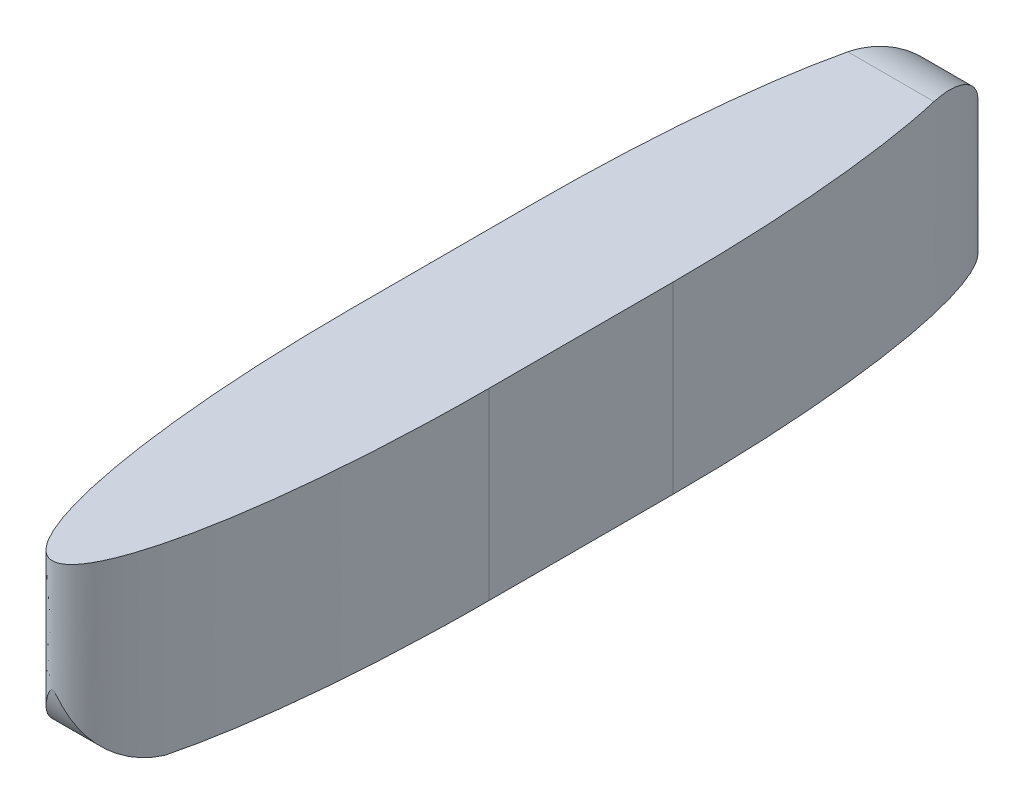
ISO-10303-21;
HEADER;
FILE_DESCRIPTION(('STEP AP214'),'2;1');
FILE_NAME('part.step','',(''),(''),'','','');
FILE_SCHEMA(('AUTOMOTIVE_DESIGN { 1 0 10303 214 1 1 1 1 }'));
ENDSEC;
DATA;
#1=APPLICATION_CONTEXT('core data for automotive mechanical design processes');
#2=APPLICATION_PROTOCOL_DEFINITION('international standard','automotive_design',2000,#1);
#3=PRODUCT_CONTEXT('',#1,'mechanical');
#4=PRODUCT('Part','Part','',(#3));
#5=PRODUCT_RELATED_PRODUCT_CATEGORY('part','',(#4));
#6=PRODUCT_DEFINITION_FORMATION('','',#4);
#7=PRODUCT_DEFINITION_CONTEXT('part definition',#1,'design');
#8=PRODUCT_DEFINITION('design','',#6,#7);
#9=PRODUCT_DEFINITION_SHAPE('','',#8);
#10=(LENGTH_UNIT() NAMED_UNIT(*) SI_UNIT(.MILLI.,.METRE.));
#11=(NAMED_UNIT(*) PLANE_ANGLE_UNIT() SI_UNIT($,.RADIAN.));
#12=(NAMED_UNIT(*) SI_UNIT($,.STERADIAN.) SOLID_ANGLE_UNIT());
#13=UNCERTAINTY_MEASURE_WITH_UNIT(LENGTH_MEASURE(1.E-05),#10,'distance_accuracy_value','');
#14=(GEOMETRIC_REPRESENTATION_CONTEXT(3) GLOBAL_UNCERTAINTY_ASSIGNED_CONTEXT((#13)) GLOBAL_UNIT_ASSIGNED_CONTEXT((#10,
#11,#12)) REPRESENTATION_CONTEXT('',''));
#15=CARTESIAN_POINT('',(0.,0.,0.));
#16=DIRECTION('',(0.,0.,1.));
#17=DIRECTION('',(1.,0.,0.));
#18=AXIS2_PLACEMENT_3D('',#15,#16,#17);
#19=CARTESIAN_POINT('',(0.,400.,0.));
#20=DIRECTION('',(1.,0.,0.));
#21=DIRECTION('',(0.,0.,-1.));
#22=AXIS2_PLACEMENT_3D('',#19,#20,#21);
#23=PLANE('',#22);
#24=DIRECTION('',(0.,0.,1.));
#25=VECTOR('',#24,1.);
#26=CARTESIAN_POINT('',(0.,0.,0.));
#27=LINE('',#26,#25);
#28=CARTESIAN_POINT('',(0.,0.,-400.));
#29=VERTEX_POINT('',#28);
#30=CARTESIAN_POINT('',(0.,0.,0.));
#31=VERTEX_POINT('',#30);
#32=EDGE_CURVE('E74',#29,#31,#27,.T.);
#33=ORIENTED_EDGE('',*,*,#32,.T.);
#34=DIRECTION('',(0.,-1.,0.));
#35=VECTOR('',#34,1.);
#36=CARTESIAN_POINT('',(0.,400.,0.));
#37=LINE('',#36,#35);
#38=CARTESIAN_POINT('',(0.,400.,0.));
#39=VERTEX_POINT('',#38);
#40=EDGE_CURVE('E112',#39,#31,#37,.T.);
#41=ORIENTED_EDGE('',*,*,#40,.F.);
#42=DIRECTION('',(0.,0.,1.));
#43=VECTOR('',#42,1.);
#44=CARTESIAN_POINT('',(0.,400.,0.));
#45=LINE('',#44,#43);
#46=CARTESIAN_POINT('',(0.,400.,-400.));
#47=VERTEX_POINT('',#46);
#48=EDGE_CURVE('E102',#47,#39,#45,.T.);
#49=ORIENTED_EDGE('',*,*,#48,.F.);
#50=DIRECTION('',(0.,-1.,0.));
#51=VECTOR('',#50,1.);
#52=CARTESIAN_POINT('',(0.,400.,-400.));
#53=LINE('',#52,#51);
#54=EDGE_CURVE('E101',#47,#29,#53,.T.);
#55=ORIENTED_EDGE('',*,*,#54,.T.);
#56=EDGE_LOOP('',(#33,#41,#49,#55));
#57=FACE_BOUND('',#56,.T.);
#58=ADVANCED_FACE('F39',(#57),#23,.F.);
#59=CARTESIAN_POINT('',(300.,400.,0.));
#60=DIRECTION('',(-1.,0.,0.));
#61=DIRECTION('',(0.,0.,1.));
#62=AXIS2_PLACEMENT_3D('',#59,#60,#61);
#63=PLANE('',#62);
#64=DIRECTION('',(0.,0.,-1.));
#65=VECTOR('',#64,1.);
#66=CARTESIAN_POINT('',(300.,0.,0.));
#67=LINE('',#66,#65);
#68=CARTESIAN_POINT('',(300.,0.,0.));
#69=VERTEX_POINT('',#68);
#70=CARTESIAN_POINT('',(300.,0.,-400.));
#71=VERTEX_POINT('',#70);
#72=EDGE_CURVE('E204',#69,#71,#67,.T.);
#73=ORIENTED_EDGE('',*,*,#72,.T.);
#74=DIRECTION('',(0.,-1.,0.));
#75=VECTOR('',#74,1.);
#76=CARTESIAN_POINT('',(300.,400.,-400.));
#77=LINE('',#76,#75);
#78=CARTESIAN_POINT('',(300.,400.,-400.));
#79=VERTEX_POINT('',#78);
#80=EDGE_CURVE('E97',#79,#71,#77,.T.);
#81=ORIENTED_EDGE('',*,*,#80,.F.);
#82=DIRECTION('',(0.,0.,-1.));
#83=VECTOR('',#82,1.);
#84=CARTESIAN_POINT('',(300.,400.,0.));
#85=LINE('',#84,#83);
#86=CARTESIAN_POINT('',(300.,400.,0.));
#87=VERTEX_POINT('',#86);
#88=EDGE_CURVE('E92',#87,#79,#85,.T.);
#89=ORIENTED_EDGE('',*,*,#88,.F.);
#90=DIRECTION('',(0.,-1.,0.));
#91=VECTOR('',#90,1.);
#92=CARTESIAN_POINT('',(300.,400.,0.));
#93=LINE('',#92,#91);
#94=EDGE_CURVE('E95',#87,#69,#93,.T.);
#95=ORIENTED_EDGE('',*,*,#94,.T.);
#96=EDGE_LOOP('',(#73,#81,#89,#95));
#97=FACE_BOUND('',#96,.T.);
#98=ADVANCED_FACE('F94',(#97),#63,.F.);
#99=CARTESIAN_POINT('',(0.,400.,0.));
#100=DIRECTION('',(0.,-1.,0.));
#101=DIRECTION('',(0.,0.,-1.));
#102=AXIS2_PLACEMENT_3D('',#99,#100,#101);
#103=PLANE('',#102);
#104=CARTESIAN_POINT('',(150.,400.,-400.));
#105=DIRECTION('',(0.,1.,0.));
#106=DIRECTION('',(0.,0.,1.));
#107=AXIS2_PLACEMENT_3D('',#104,#105,#106);
#108=ELLIPSE('',#107,800.,150.);
#109=CARTESIAN_POINT('',(243.770889506856,400.,-1024.41058357816));
#110=VERTEX_POINT('',#109);
#111=EDGE_CURVE('E128',#79,#110,#108,.T.);
#112=ORIENTED_EDGE('',*,*,#111,.T.);
#113=DIRECTION('',(-1.,0.,0.));
#114=VECTOR('',#113,1.);
#115=CARTESIAN_POINT('',(400.,400.,-1024.41058357816));
#116=LINE('',#115,#114);
#117=CARTESIAN_POINT('',(56.2291104931438,400.,-1024.41058357816));
#118=VERTEX_POINT('',#117);
#119=EDGE_CURVE('E120',#110,#118,#116,.T.);
#120=ORIENTED_EDGE('',*,*,#119,.T.);
#121=EDGE_CURVE('E61',#118,#47,#108,.T.);
#122=ORIENTED_EDGE('',*,*,#121,.T.);
#123=ORIENTED_EDGE('',*,*,#48,.T.);
#124=CARTESIAN_POINT('',(150.,400.,-1.11022302462516E-13));
#125=DIRECTION('',(0.,1.,0.));
#126=DIRECTION('',(0.,0.,1.));
#127=AXIS2_PLACEMENT_3D('',#124,#125,#126);
#128=ELLIPSE('',#127,800.,150.);
#129=EDGE_CURVE('E108',#39,#87,#128,.T.);
#130=ORIENTED_EDGE('',*,*,#129,.T.);
#131=ORIENTED_EDGE('',*,*,#88,.T.);
#132=EDGE_LOOP('',(#112,#120,#122,#123,#130,#131));
#133=FACE_BOUND('',#132,.T.);
#134=ADVANCED_FACE('F114',(#133),#103,.F.);
#135=CARTESIAN_POINT('',(0.,0.,0.));
#136=DIRECTION('',(0.,-1.,0.));
#137=DIRECTION('',(0.,0.,-1.));
#138=AXIS2_PLACEMENT_3D('',#135,#136,#137);
#139=PLANE('',#138);
#140=DIRECTION('',(-1.,0.,0.));
#141=VECTOR('',#140,1.);
#142=CARTESIAN_POINT('',(400.,0.,643.353757445879));
#143=LINE('',#142,#141);
#144=CARTESIAN_POINT('',(239.155400780709,0.,643.353757445879));
#145=VERTEX_POINT('',#144);
#146=CARTESIAN_POINT('',(60.8445992192913,0.,643.353757445879));
#147=VERTEX_POINT('',#146);
#148=EDGE_CURVE('E115',#145,#147,#143,.T.);
#149=ORIENTED_EDGE('',*,*,#148,.T.);
#150=CARTESIAN_POINT('',(150.,0.,-1.11022302462516E-13));
#151=DIRECTION('',(0.,1.,0.));
#152=DIRECTION('',(0.,0.,1.));
#153=AXIS2_PLACEMENT_3D('',#150,#151,#152);
#154=ELLIPSE('',#153,800.,150.);
#155=EDGE_CURVE('E117',#31,#147,#154,.T.);
#156=ORIENTED_EDGE('',*,*,#155,.F.);
#157=ORIENTED_EDGE('',*,*,#32,.F.);
#158=CARTESIAN_POINT('',(150.,0.,-400.));
#159=DIRECTION('',(0.,1.,0.));
#160=DIRECTION('',(0.,0.,1.));
#161=AXIS2_PLACEMENT_3D('',#158,#159,#160);
#162=ELLIPSE('',#161,800.,150.);
#163=EDGE_CURVE('E124',#71,#29,#162,.T.);
#164=ORIENTED_EDGE('',*,*,#163,.F.);
#165=ORIENTED_EDGE('',*,*,#72,.F.);
#166=EDGE_CURVE('E110',#145,#69,#154,.T.);
#167=ORIENTED_EDGE('',*,*,#166,.F.);
#168=EDGE_LOOP('',(#149,#156,#157,#164,#165,#167));
#169=FACE_BOUND('',#168,.T.);
#170=ADVANCED_FACE('F135',(#169),#139,.T.);
#171=DIRECTION('',(0.,1.,0.));
#172=VECTOR('',#171,1.);
#173=SURFACE_OF_LINEAR_EXTRUSION('',#162,#172);
#174=CARTESIAN_POINT('',(243.770889506857,400.,-1024.41058357816));
#175=CARTESIAN_POINT('',(243.163301228322,399.955558802038,-1027.00601896267));
#176=CARTESIAN_POINT('',(242.546728650748,399.854515992237,-1029.59835873491));
#177=CARTESIAN_POINT('',(241.295948376345,399.540181654458,-1034.77143362733));
#178=CARTESIAN_POINT('',(240.661744061431,399.326911513841,-1037.35217086414));
#179=CARTESIAN_POINT('',(239.37586482704,398.789085601332,-1042.49736902288));
#180=CARTESIAN_POINT('',(238.724191617104,398.464540682626,-1045.06183150733));
#181=CARTESIAN_POINT('',(237.403579271261,397.705368678969,-1050.16985649317));
#182=CARTESIAN_POINT('',(236.734640569988,397.27074436269,-1052.71341951856));
#183=CARTESIAN_POINT('',(235.381020827399,396.293715391588,-1057.77024737073));
#184=CARTESIAN_POINT('',(234.696371589303,395.751513960743,-1060.28355998999));
#185=CARTESIAN_POINT('',(233.31040683478,394.560395339782,-1065.28017481669));
#186=CARTESIAN_POINT('',(232.609090977733,393.911475967046,-1067.76347640923));
#187=CARTESIAN_POINT('',(231.190113232056,392.508692531502,-1072.69557013919));
#188=CARTESIAN_POINT('',(230.472451068561,391.754826702923,-1075.14436169519));
#189=CARTESIAN_POINT('',(229.021138847086,390.144121673066,-1080.00300473195));
#190=CARTESIAN_POINT('',(228.287488902964,389.287283204927,-1082.4128564898));
#191=CARTESIAN_POINT('',(226.804747847893,387.472989160374,-1087.18878525028));
#192=CARTESIAN_POINT('',(226.055660698571,386.515559146393,-1089.55487319534));
#193=CARTESIAN_POINT('',(224.542252367749,384.502199958145,-1094.23977906014));
#194=CARTESIAN_POINT('',(223.777931244497,383.446271160436,-1096.55859716055));
#195=CARTESIAN_POINT('',(222.234455083313,381.238357533732,-1101.14499794535));
#196=CARTESIAN_POINT('',(221.455300019025,380.086372534065,-1103.41258053869));
#197=CARTESIAN_POINT('',(219.882590634366,377.688958144709,-1107.8926376668));
#198=CARTESIAN_POINT('',(219.089036501895,376.443529973747,-1110.10511291981));
#199=CARTESIAN_POINT('',(217.487903251414,373.861856228638,-1114.47144479331));
#200=CARTESIAN_POINT('',(216.680323146856,372.52560424678,-1116.62529726288));
#201=CARTESIAN_POINT('',(215.051653965621,369.765228519628,-1120.87066094383));
#202=CARTESIAN_POINT('',(214.23056495374,368.341105195724,-1122.96217245411));
#203=CARTESIAN_POINT('',(212.575337282498,365.40794370607,-1127.07948857427));
#204=CARTESIAN_POINT('',(211.741198478563,363.898904599094,-1129.10529245544));
#205=CARTESIAN_POINT('',(210.060362553556,360.79900884726,-1133.08793124485));
#206=CARTESIAN_POINT('',(209.213665335224,359.208151568515,-1135.04476561856));
#207=CARTESIAN_POINT('',(207.484810548002,355.903073398828,-1138.93907987682));
#208=CARTESIAN_POINT('',(206.602317505449,354.186665138648,-1140.8745548699));
#209=CARTESIAN_POINT('',(204.825080552977,350.674263332979,-1144.66639973427));
#210=CARTESIAN_POINT('',(203.930335492516,348.878262277316,-1146.52276210813));
#211=CARTESIAN_POINT('',(202.129314920947,345.210637221389,-1150.1530263522));
#212=CARTESIAN_POINT('',(201.223040347003,343.339019340982,-1151.92693487073));
#213=CARTESIAN_POINT('',(199.399368718077,339.523570692962,-1155.38979374384));
#214=CARTESIAN_POINT('',(198.481970450021,337.579732000858,-1157.07873472713));
#215=CARTESIAN_POINT('',(196.63610797665,333.622522826414,-1160.36989505152));
#216=CARTESIAN_POINT('',(195.707636657447,331.609105870976,-1161.97205452072));
#217=CARTESIAN_POINT('',(193.840940883407,327.518134730804,-1165.08573302975));
#218=CARTESIAN_POINT('',(192.902717470513,325.440587352166,-1166.59726163837));
#219=CARTESIAN_POINT('',(191.016959672968,321.224990034922,-1169.52762021213));
#220=CARTESIAN_POINT('',(190.069424728931,319.086936446755,-1170.94644456846));
#221=CARTESIAN_POINT('',(188.165789454975,314.754678615365,-1173.68901486912));
#222=CARTESIAN_POINT('',(187.209689597173,312.560477454895,-1175.01276601827));
#223=CARTESIAN_POINT('',(184.929393953401,307.287176710106,-1178.04153866294));
#224=CARTESIAN_POINT('',(183.601585942738,304.184739166246,-1179.70343274105));
#225=CARTESIAN_POINT('',(180.932340615647,297.89184370421,-1182.83920008838));
#226=CARTESIAN_POINT('',(179.590902461223,294.701380353165,-1184.31306172069));
#227=CARTESIAN_POINT('',(176.89578366386,288.242964673721,-1187.06881768774));
#228=CARTESIAN_POINT('',(175.542101251262,284.975001029841,-1188.35068378766));
#229=CARTESIAN_POINT('',(172.826732524689,278.379347880222,-1190.71643591746));
#230=CARTESIAN_POINT('',(171.465065566811,275.051779587617,-1191.80068257352));
#231=CARTESIAN_POINT('',(168.732710966283,268.342555990636,-1193.77105178039));
#232=CARTESIAN_POINT('',(167.362024780282,264.960909299844,-1194.65720555309));
#233=CARTESIAN_POINT('',(165.300283929627,259.857581819469,-1195.83589837484));
#234=CARTESIAN_POINT('',(164.612238867626,258.151712966726,-1196.20364121326));
#235=CARTESIAN_POINT('',(163.234060217831,254.730775237228,-1196.88885831842));
#236=CARTESIAN_POINT('',(162.543926736023,253.015706824047,-1197.20633509397));
#237=CARTESIAN_POINT('',(161.351542987392,250.050789047868,-1197.71041583411));
#238=CARTESIAN_POINT('',(160.849830218192,248.802741503017,-1197.90899743673));
#239=CARTESIAN_POINT('',(159.845051242289,246.303413620965,-1198.2795462031));
#240=CARTESIAN_POINT('',(159.341985204667,245.052133688333,-1198.45151654765));
#241=CARTESIAN_POINT('',(158.334306910021,242.547595761693,-1198.76872382996));
#242=CARTESIAN_POINT('',(157.829695630818,241.294339194608,-1198.91397510491));
#243=CARTESIAN_POINT('',(157.070713473909,239.413200017718,-1199.11184723197));
#244=CARTESIAN_POINT('',(156.81737287787,238.785938801505,-1199.17447096028));
#245=CARTESIAN_POINT('',(156.309771315159,237.531159163486,-1199.29304477842));
#246=CARTESIAN_POINT('',(156.055510353844,236.903640743196,-1199.34899490704));
#247=CARTESIAN_POINT('',(155.578287943386,235.728756905954,-1199.44749289395));
#248=CARTESIAN_POINT('',(155.35547891247,235.181396360224,-1199.49083974609));
#249=CARTESIAN_POINT('',(154.908497273986,234.0868565934,-1199.57244866053));
#250=CARTESIAN_POINT('',(154.684324674898,233.539677371199,-1199.61071075443));
#251=CARTESIAN_POINT('',(154.233932760192,232.445724451059,-1199.68215239861));
#252=CARTESIAN_POINT('',(154.00771312382,231.898950831724,-1199.71533113724));
#253=CARTESIAN_POINT('',(153.665937503353,231.079602606876,-1199.76127760672));
#254=CARTESIAN_POINT('',(153.551605340207,230.806623640076,-1199.77595607525));
#255=CARTESIAN_POINT('',(153.321853139807,230.26105859004,-1199.80403829628));
#256=CARTESIAN_POINT('',(153.206433106695,229.988472505313,-1199.81744205362));
#257=CARTESIAN_POINT('',(152.989281471489,229.479419945641,-1199.8413069013));
#258=CARTESIAN_POINT('',(152.887730050089,229.242883965152,-1199.85192371025));
#259=CARTESIAN_POINT('',(152.683118806822,228.77041646293,-1199.87219155364));
#260=CARTESIAN_POINT('',(152.580058952905,228.534484954165,-1199.88184256752));
#261=CARTESIAN_POINT('',(152.371859059734,228.063577939092,-1199.90017376564));
#262=CARTESIAN_POINT('',(152.266719590656,227.828602191468,-1199.90885421175));
#263=CARTESIAN_POINT('',(152.053363470422,227.36002373619,-1199.92524280789));
#264=CARTESIAN_POINT('',(151.945146974707,227.126420959895,-1199.93295100691));
#265=CARTESIAN_POINT('',(151.756854711434,226.730842788499,-1199.94523347046));
#266=CARTESIAN_POINT('',(151.678015363587,226.568290166887,-1199.95005663423));
#267=CARTESIAN_POINT('',(151.557084787498,226.325742808459,-1199.956925201));
#268=CARTESIAN_POINT('',(151.516321321171,226.245092052071,-1199.95915408291));
#269=CARTESIAN_POINT('',(151.433688512885,226.084356601835,-1199.96348797571));
#270=CARTESIAN_POINT('',(151.391819195361,226.004271895528,-1199.96559298935));
#271=CARTESIAN_POINT('',(151.291584090017,225.816547562515,-1199.97040197772));
#272=CARTESIAN_POINT('',(151.232637216558,225.709215470102,-1199.9730533954));
#273=CARTESIAN_POINT('',(151.111188107339,225.496693429717,-1199.97811459557));
#274=CARTESIAN_POINT('',(151.048689728526,225.391501320212,-1199.98052463262));
#275=CARTESIAN_POINT('',(150.939460057334,225.218323610929,-1199.98434363521));
#276=CARTESIAN_POINT('',(150.89423507877,225.149393495362,-1199.98582272264));
#277=CARTESIAN_POINT('',(150.800140345653,225.013708661653,-1199.9886578919));
#278=CARTESIAN_POINT('',(150.751260323343,224.946960891494,-1199.99001360154));
#279=CARTESIAN_POINT('',(150.673822396334,224.849565869225,-1199.99194008285));
#280=CARTESIAN_POINT('',(150.647180258229,224.817402010683,-1199.99256724807));
#281=CARTESIAN_POINT('',(150.592264770791,224.754505476402,-1199.99377736941));
#282=CARTESIAN_POINT('',(150.563992091893,224.723772221697,-1199.99436034346));
#283=CARTESIAN_POINT('',(150.505517327442,224.664402563005,-1199.99547206521));
#284=CARTESIAN_POINT('',(150.475322858141,224.63575874249,-1199.99600100768));
#285=CARTESIAN_POINT('',(150.412448871204,224.581376049671,-1199.99699330016));
#286=CARTESIAN_POINT('',(150.379773477403,224.555632526041,-1199.99745675551));
#287=CARTESIAN_POINT('',(150.317736394768,224.51285590834,-1199.99821897932));
#288=CARTESIAN_POINT('',(150.288886176671,224.495093042818,-1199.99853234809));
#289=CARTESIAN_POINT('',(150.22902337513,224.463647668718,-1199.99908338085));
#290=CARTESIAN_POINT('',(150.198014002103,224.449959255268,-1199.99932115443));
#291=CARTESIAN_POINT('',(150.138958801787,224.429808613281,-1199.99966972464));
#292=CARTESIAN_POINT('',(150.111187470398,224.422560272908,-1199.99979439944));
#293=CARTESIAN_POINT('',(150.054817865067,224.412883242615,-1199.99996064263));
#294=CARTESIAN_POINT('',(150.026220549388,224.41044917862,-1200.00000230368));
#295=CARTESIAN_POINT('',(149.969002341575,224.410729812589,-1199.99999749349));
#296=CARTESIAN_POINT('',(149.940381493569,224.41345337891,-1199.99995087045));
#297=CARTESIAN_POINT('',(149.884010616597,224.423687321926,-1199.99977501287));
#298=CARTESIAN_POINT('',(149.856261627347,224.431203202001,-1199.99964568334));
#299=CARTESIAN_POINT('',(149.7910702193,224.454072778959,-1199.99924986519));
#300=CARTESIAN_POINT('',(149.754324532576,224.471377383533,-1199.99894886635));
#301=CARTESIAN_POINT('',(149.683890200216,224.511347347785,-1199.99824577441));
#302=CARTESIAN_POINT('',(149.65021086541,224.53402832737,-1199.99784338652));
#303=CARTESIAN_POINT('',(149.575922347886,224.590200540361,-1199.99683415291));
#304=CARTESIAN_POINT('',(149.536242838957,224.624898261046,-1199.99620212295));
#305=CARTESIAN_POINT('',(149.460336557592,224.697925817632,-1199.99484804833));
#306=CARTESIAN_POINT('',(149.424117285819,224.736263200103,-1199.99412581563));
#307=CARTESIAN_POINT('',(149.354117107733,224.815511880436,-1199.9926055856));
#308=CARTESIAN_POINT('',(149.32035320137,224.856438017013,-1199.991807135));
#309=CARTESIAN_POINT('',(149.254928697002,224.939848686423,-1199.99014990404));
#310=CARTESIAN_POINT('',(149.223265907041,224.982331521059,-1199.98929118852));
#311=CARTESIAN_POINT('',(149.14720383823,225.088446370726,-1199.98710721304));
#312=CARTESIAN_POINT('',(149.103722851432,225.152732976031,-1199.98575057583));
#313=CARTESIAN_POINT('',(149.019234457174,225.282917491428,-1199.98293099106));
#314=CARTESIAN_POINT('',(148.97822783337,225.348815902805,-1199.98146801012));
#315=CARTESIAN_POINT('',(148.89800772501,225.481862156237,-1199.97843926179));
#316=CARTESIAN_POINT('',(148.858797865162,225.549012169936,-1199.9768733009));
#317=CARTESIAN_POINT('',(148.781832446595,225.684140369494,-1199.97364481997));
#318=CARTESIAN_POINT('',(148.744076992123,225.752118614258,-1199.97198229302));
#319=CARTESIAN_POINT('',(148.632452914944,225.957112646226,-1199.96685040413));
#320=CARTESIAN_POINT('',(148.560302370288,226.095058980897,-1199.9632396556));
#321=CARTESIAN_POINT('',(148.419081203828,226.372385026756,-1199.95565496826));
#322=CARTESIAN_POINT('',(148.350008711844,226.511763802464,-1199.95168125457));
#323=CARTESIAN_POINT('',(148.21411098977,226.791363104767,-1199.9433795404));
#324=CARTESIAN_POINT('',(148.147282805277,226.931582213412,-1199.93905203368));
#325=CARTESIAN_POINT('',(148.01524920301,227.212679276094,-1199.93004340617));
#326=CARTESIAN_POINT('',(147.95004295955,227.353556849659,-1199.92536247042));
#327=CARTESIAN_POINT('',(147.757272166714,227.774680829226,-1199.91086851491));
#328=CARTESIAN_POINT('',(147.631459515632,228.055710490209,-1199.9005363927));
#329=CARTESIAN_POINT('',(147.382753509483,228.619007170997,-1199.87848771092));
#330=CARTESIAN_POINT('',(147.259860253253,228.901274232312,-1199.86677110455));
#331=CARTESIAN_POINT('',(147.015974268985,229.466801871911,-1199.84194842241));
#332=CARTESIAN_POINT('',(146.894982935866,229.750063008594,-1199.82884137689));
#333=CARTESIAN_POINT('',(146.654413030564,230.317118031272,-1199.80124659651));
#334=CARTESIAN_POINT('',(146.534834466933,230.600911920479,-1199.78675885331));
#335=CARTESIAN_POINT('',(146.17758848174,231.452948795219,-1199.74122017861));
#336=CARTESIAN_POINT('',(145.941461613535,232.021728071277,-1199.70809901547));
#337=CARTESIAN_POINT('',(145.472006615504,233.159007497301,-1199.63640202108));
#338=CARTESIAN_POINT('',(145.238674560838,233.727506598596,-1199.59783514225));
#339=CARTESIAN_POINT('',(144.773655292037,234.864615152606,-1199.51522075707));
#340=CARTESIAN_POINT('',(144.541967685727,235.433224543347,-1199.47117460727));
#341=CARTESIAN_POINT('',(144.079710357383,236.570415931204,-1199.37760047013));
#342=CARTESIAN_POINT('',(143.849140588472,237.13899792846,-1199.32807271476));
#343=CARTESIAN_POINT('',(143.155756542211,238.851580237291,-1199.17061662345));
#344=CARTESIAN_POINT('',(142.694160272626,239.995317168274,-1199.05433059009));
#345=CARTESIAN_POINT('',(141.772935663913,242.281139464509,-1198.79959807672));
#346=CARTESIAN_POINT('',(141.313307376752,243.423224785627,-1198.66115101517));
#347=CARTESIAN_POINT('',(140.39532299724,245.705464548337,-1198.36208697377));
#348=CARTESIAN_POINT('',(139.936967388591,246.845618204783,-1198.20146249971));
#349=CARTESIAN_POINT('',(139.021411993372,249.123034112026,-1197.85813161368));
#350=CARTESIAN_POINT('',(138.564212198692,250.260296383113,-1197.67542535709));
#351=CARTESIAN_POINT('',(137.194057563,253.667160897525,-1197.09423433706));
#352=CARTESIAN_POINT('',(136.282561929795,255.931804832912,-1196.66268204081));
#353=CARTESIAN_POINT('',(134.461477460458,260.44830128081,-1195.71104312948));
#354=CARTESIAN_POINT('',(133.551895521146,262.700121380374,-1195.19079012573));
#355=CARTESIAN_POINT('',(131.736498173466,267.183223755189,-1194.06293841946));
#356=CARTESIAN_POINT('',(130.830682590734,269.414506987134,-1193.45534380783));
#357=CARTESIAN_POINT('',(129.0229600605,273.85356706227,-1192.15344631621));
#358=CARTESIAN_POINT('',(128.121053711589,276.061340376067,-1191.45913061107));
#359=CARTESIAN_POINT('',(125.835772583975,281.634754772743,-1189.58653125137));
#360=CARTESIAN_POINT('',(124.455339944416,284.98200914266,-1188.34933454791));
#361=CARTESIAN_POINT('',(121.706047443707,291.601472342344,-1185.67450301097));
#362=CARTESIAN_POINT('',(120.337191142301,294.873658582969,-1184.2368087426));
#363=CARTESIAN_POINT('',(117.612917447098,301.330803464185,-1181.16522019572));
#364=CARTESIAN_POINT('',(116.257501153837,304.515754998584,-1179.53130999137));
#365=CARTESIAN_POINT('',(113.561277462733,310.788134194104,-1176.07134630113));
#366=CARTESIAN_POINT('',(112.220477146665,313.87551584604,-1174.24520387518));
#367=CARTESIAN_POINT('',(109.555908117991,319.93970094942,-1170.40696556552));
#368=CARTESIAN_POINT('',(108.232138182797,322.916512367833,-1168.39488311602));
#369=CARTESIAN_POINT('',(105.603179673593,328.748767531055,-1164.19065095095));
#370=CARTESIAN_POINT('',(104.297990638396,331.60421429169,-1161.99850571381));
#371=CARTESIAN_POINT('',(102.034907914704,336.478492360445,-1158.0163942398));
#372=CARTESIAN_POINT('',(101.072517380202,338.52655285334,-1156.2645984262));
#373=CARTESIAN_POINT('',(99.1596341362072,342.544576285961,-1152.66704573246));
#374=CARTESIAN_POINT('',(98.2091421939677,344.514534206985,-1150.82128283156));
#375=CARTESIAN_POINT('',(96.3208058849388,348.371842170567,-1147.03917075725));
#376=CARTESIAN_POINT('',(95.3829616293831,350.259191486928,-1145.10282078782));
#377=CARTESIAN_POINT('',(93.5205944758043,353.947023982001,-1141.14302845059));
#378=CARTESIAN_POINT('',(92.596071289568,355.747509042083,-1139.11958797084));
#379=CARTESIAN_POINT('',(90.7608888383317,359.257698497223,-1134.98905870525));
#380=CARTESIAN_POINT('',(89.8502307396238,360.967395285191,-1132.88196293576));
#381=CARTESIAN_POINT('',(88.0434830883982,364.291866475311,-1128.58815112314));
#382=CARTESIAN_POINT('',(87.1473935071508,365.906641064671,-1126.40143523707));
#383=CARTESIAN_POINT('',(85.3703925019661,369.037421300807,-1121.95245758563));
#384=CARTESIAN_POINT('',(84.4894808596696,370.553428369388,-1119.69019690847));
#385=CARTESIAN_POINT('',(82.7434964303385,373.482870094365,-1115.09460794956));
#386=CARTESIAN_POINT('',(81.8784224772611,374.896312324942,-1112.76128493369));
#387=CARTESIAN_POINT('',(79.9092761835372,378.02259071616,-1107.32264122374));
#388=CARTESIAN_POINT('',(78.8107639181788,379.699206330982,-1104.19438320823));
#389=CARTESIAN_POINT('',(76.6424185201172,382.866662164612,-1097.83556132831));
#390=CARTESIAN_POINT('',(75.5725859454809,384.357498770476,-1094.60499547579));
#391=CARTESIAN_POINT('',(73.4625613761291,387.146881308053,-1088.05190715309));
#392=CARTESIAN_POINT('',(72.422372983709,388.445403949981,-1084.7293736031));
#393=CARTESIAN_POINT('',(70.3742125801782,390.8421587067,-1078.008644019));
#394=CARTESIAN_POINT('',(69.3661983799941,391.940662815546,-1074.61055789287));
#395=CARTESIAN_POINT('',(67.3819884357206,393.933974278235,-1067.74659138518));
#396=CARTESIAN_POINT('',(66.4057887478026,394.828806962765,-1064.28071949244));
#397=CARTESIAN_POINT('',(64.4863230241762,396.409825267073,-1057.29433692711));
#398=CARTESIAN_POINT('',(63.5430407704151,397.096114955969,-1053.77385443179));
#399=CARTESIAN_POINT('',(62.2450329955701,397.908888206648,-1048.81210697437));
#400=CARTESIAN_POINT('',(61.8762347020989,398.124443506126,-1047.38863059891));
#401=CARTESIAN_POINT('',(61.1440972941316,398.521208634597,-1044.53579361856));
#402=CARTESIAN_POINT('',(60.7807569864908,398.70242607367,-1043.10643438937));
#403=CARTESIAN_POINT('',(60.0595511514722,399.030336865624,-1040.24257122256));
#404=CARTESIAN_POINT('',(59.7016850091495,399.177034123386,-1038.80806788548));
#405=CARTESIAN_POINT('',(58.9919890390233,399.435543168708,-1035.93688000774));
#406=CARTESIAN_POINT('',(58.6401504765157,399.547410346381,-1034.50020261929));
#407=CARTESIAN_POINT('',(57.9419240721707,399.73642205334,-1031.62307308507));
#408=CARTESIAN_POINT('',(57.595536843868,399.813562700829,-1030.18262053539));
#409=CARTESIAN_POINT('',(56.9082087863219,399.932979466349,-1027.29862480247));
#410=CARTESIAN_POINT('',(56.5672692216684,399.975247601341,-1025.85508098736));
#411=CARTESIAN_POINT('',(56.2291104931438,400.,-1024.41058357816));
#412=B_SPLINE_CURVE_WITH_KNOTS('',3,(#174,#175,#176,#177,#178,#179,#180,#181,#182,#183,#184,
#185,#186,#187,#188,#189,#190,#191,#192,#193,#194,#195,#196,#197,#198,#199,#200,#201,#202,#203,
#204,#205,#206,#207,#208,#209,#210,#211,#212,#213,#214,#215,#216,#217,#218,#219,#220,#221,#222,
#223,#224,#225,#226,#227,#228,#229,#230,#231,#232,#233,#234,#235,#236,#237,#238,#239,#240,#241,
#242,#243,#244,#245,#246,#247,#248,#249,#250,#251,#252,#253,#254,#255,#256,#257,#258,#259,#260,
#261,#262,#263,#264,#265,#266,#267,#268,#269,#270,#271,#272,#273,#274,#275,#276,#277,#278,#279,
#280,#281,#282,#283,#284,#285,#286,#287,#288,#289,#290,#291,#292,#293,#294,#295,#296,#297,#298,
#299,#300,#301,#302,#303,#304,#305,#306,#307,#308,#309,#310,#311,#312,#313,#314,#315,#316,#317,
#318,#319,#320,#321,#322,#323,#324,#325,#326,#327,#328,#329,#330,#331,#332,#333,#334,#335,#336,
#337,#338,#339,#340,#341,#342,#343,#344,#345,#346,#347,#348,#349,#350,#351,#352,#353,#354,#355,
#356,#357,#358,#359,#360,#361,#362,#363,#364,#365,#366,#367,#368,#369,#370,#371,#372,#373,#374,
#375,#376,#377,#378,#379,#380,#381,#382,#383,#384,#385,#386,#387,#388,#389,#390,#391,#392,#393,
#394,#395,#396,#397,#398,#399,#400,#401,#402,#403,#404,#405,#406,#407,#408,#409,#410,#411),
.UNSPECIFIED.,.F.,.F.,(4,2,2,2,2,2,2,2,2,2,2,2,2,2,2,2,2,2,2,2,2,2,2,2,2,2,2,2,2,2,2,2,2,2,2,2,
2,2,2,2,2,2,2,2,2,2,2,2,2,2,2,2,2,2,2,2,2,2,2,2,2,2,2,2,2,2,2,2,2,2,2,2,2,2,2,2,2,2,2,2,2,2,2,2,
2,2,2,2,2,2,2,2,2,2,2,2,2,2,2,2,2,2,2,2,2,2,2,2,2,2,2,2,2,2,2,2,2,2,4),(0.,7.99727664027056,
15.993029776973,23.9880032696335,31.9827756959796,39.9625865781377,47.9425606855765,
55.9226690760045,63.9027206536005,71.8807492145029,79.8587472769027,87.8367595149586,
95.8146677184911,103.793139356843,111.771572737174,119.750094569795,127.728678225366,
135.926219320215,144.124535568177,152.322189630175,160.520745859006,168.72488817616,
176.928162769466,185.131933219817,193.335254208966,204.614167079833,215.893777638677,
227.175045349012,238.435515671497,249.694209950367,255.321052204388,260.947613531016,
265.026458576872,269.10481570599,273.180978003225,275.219096607907,277.257203366837,
279.034858699057,280.812502986133,282.590430812454,283.479383371079,284.368332546334,
285.141225795215,285.91413548968,286.686836131431,287.45949780806,288.001645183121,
288.272822146187,288.543993121865,288.911400692171,289.27841661134,289.525722103178,
289.773750503664,289.899019097319,290.024236546053,290.148985400514,290.273531253136,
290.374948496796,290.476218038461,290.561962037125,290.647610267441,290.733405900499,
290.819300237148,290.940453515071,291.06196318775,291.219718853126,291.377809070527,
291.5369062079,291.695834672098,291.928612268128,292.161463204298,292.394764879358,
292.628083245583,293.095168002208,293.561964983671,294.028121251625,294.494035142991,
295.418239689048,296.342475479724,297.267360166328,298.192250448249,300.042419297231,
301.88958124514,303.736286781539,305.582914193486,309.299216705987,313.015616754212,
316.733275740851,320.450908568488,327.886291424059,335.335778522177,342.784916817262,
350.235158070211,361.707609813542,373.183469673121,384.660261599509,396.142387026757,
407.623683515605,419.104694535209,427.687440038512,436.270736159528,444.854107719522,
453.437293290954,462.021196910698,470.605083600497,479.188846693924,487.771975249377,
498.911620819645,510.051482994825,521.192693138741,532.31863794284,543.443198252271,
554.562197925831,559.020463140323,563.477739139504,567.934510694325,572.384158030897,
576.834302634034,581.285465684731),.UNSPECIFIED.);
#413=EDGE_CURVE('E11',#110,#118,#412,.T.);
#414=ORIENTED_EDGE('',*,*,#413,.F.);
#415=ORIENTED_EDGE('',*,*,#111,.F.);
#416=ORIENTED_EDGE('',*,*,#80,.T.);
#417=ORIENTED_EDGE('',*,*,#163,.T.);
#418=ORIENTED_EDGE('',*,*,#54,.F.);
#419=ORIENTED_EDGE('',*,*,#121,.F.);
#420=EDGE_LOOP('',(#414,#415,#416,#417,#418,#419));
#421=FACE_BOUND('',#420,.T.);
#422=ADVANCED_FACE('F130',(#421),#173,.T.);
#423=DIRECTION('',(0.,1.,0.));
#424=VECTOR('',#423,1.);
#425=SURFACE_OF_LINEAR_EXTRUSION('',#154,#424);
#426=CARTESIAN_POINT('',(239.155400780709,0.,643.353757445879));
#427=CARTESIAN_POINT('',(238.530766093788,0.299273296008533,645.815974513094));
#428=CARTESIAN_POINT('',(237.898058510155,0.649357812685615,648.269947469416));
#429=CARTESIAN_POINT('',(236.616846689006,1.44982406170865,653.156801784059));
#430=CARTESIAN_POINT('',(235.968345569609,1.90018613693933,655.589687179137));
#431=CARTESIAN_POINT('',(234.655723076272,2.89994556275868,660.43046476344));
#432=CARTESIAN_POINT('',(233.991603426311,3.44933202719594,662.838359669229));
#433=CARTESIAN_POINT('',(232.647950469406,4.64569074969144,667.625315722199));
#434=CARTESIAN_POINT('',(231.968417803169,5.29265895764361,670.004378061643));
#435=CARTESIAN_POINT('',(230.594170433263,6.68259876507967,674.729864824013));
#436=CARTESIAN_POINT('',(229.899455618593,7.42557106667015,677.076289008107));
#437=CARTESIAN_POINT('',(228.498349772924,9.00213076687778,681.721980172364));
#438=CARTESIAN_POINT('',(227.792026888158,9.8352870421777,684.021414050242));
#439=CARTESIAN_POINT('',(226.36491551373,11.5930929142372,688.580458306743));
#440=CARTESIAN_POINT('',(225.644127095869,12.5177420569449,690.840068882934));
#441=CARTESIAN_POINT('',(224.18840925156,14.456490890656,695.31584784162));
#442=CARTESIAN_POINT('',(223.453480262607,15.4705878177012,697.532017563864));
#443=CARTESIAN_POINT('',(221.969830311638,17.5860354431286,701.917380110394));
#444=CARTESIAN_POINT('',(221.221110369299,18.6873797103311,704.086576382207));
#445=CARTESIAN_POINT('',(219.710259663145,20.9749578785296,708.374527461483));
#446=CARTESIAN_POINT('',(218.948130742068,22.1611801827649,710.493289107237));
#447=CARTESIAN_POINT('',(217.364806677329,24.689548971601,714.802358591037));
#448=CARTESIAN_POINT('',(216.542800986543,26.0367760623103,716.989389630942));
#449=CARTESIAN_POINT('',(214.884498289175,28.8209004290965,721.299618620237));
#450=CARTESIAN_POINT('',(214.048202959554,30.2577872349225,723.42282398029));
#451=CARTESIAN_POINT('',(212.36168161814,33.2181970824987,727.602044355137));
#452=CARTESIAN_POINT('',(211.51145638675,34.7417152825785,729.658063114774));
#453=CARTESIAN_POINT('',(209.797455008769,37.8722144536837,733.699639495704));
#454=CARTESIAN_POINT('',(208.933679078792,39.4791940914863,735.685198241682));
#455=CARTESIAN_POINT('',(207.192732547207,42.7737501320217,739.583216878917));
#456=CARTESIAN_POINT('',(206.315558377371,44.4613482690053,741.495656804751));
#457=CARTESIAN_POINT('',(204.54841962645,47.9133292998741,745.243865534849));
#458=CARTESIAN_POINT('',(203.658454779384,49.6777137920806,747.079632741596));
#459=CARTESIAN_POINT('',(201.866118856751,53.279701201988,750.671588103309));
#460=CARTESIAN_POINT('',(200.963747615646,55.1173050972718,752.427775195099));
#461=CARTESIAN_POINT('',(199.146954627467,58.8620621063381,755.85781918299));
#462=CARTESIAN_POINT('',(198.232533031537,60.769214348331,757.53167711047));
#463=CARTESIAN_POINT('',(196.549673057067,64.3167996095571,760.51488996617));
#464=CARTESIAN_POINT('',(195.783070332483,65.9469354615234,761.837554503754));
#465=CARTESIAN_POINT('',(194.241919091481,69.2502279997805,764.423247714061));
#466=CARTESIAN_POINT('',(193.467370513004,70.9233850222338,765.686275920573));
#467=CARTESIAN_POINT('',(191.910401876942,74.3105360085128,768.151424146513));
#468=CARTESIAN_POINT('',(191.127981456266,76.0245318610814,769.353541340815));
#469=CARTESIAN_POINT('',(189.555281405619,79.4911375077107,771.695669786861));
#470=CARTESIAN_POINT('',(188.765001179897,81.2437502412458,772.835676287712));
#471=CARTESIAN_POINT('',(187.176525316908,84.7852896751431,775.052435002287));
#472=CARTESIAN_POINT('',(186.37832891649,86.5742198944019,776.129181046801));
#473=CARTESIAN_POINT('',(184.774069284109,90.1855457128391,778.218058685111));
#474=CARTESIAN_POINT('',(183.968007242408,92.0079362843472,779.230199885605));
#475=CARTESIAN_POINT('',(182.34760071817,95.6839377965659,781.189027118957));
#476=CARTESIAN_POINT('',(181.533256249319,97.5375486856953,782.135713259943));
#477=CARTESIAN_POINT('',(179.895873488792,101.273125406247,783.962562250887));
#478=CARTESIAN_POINT('',(179.072836411434,103.155087292423,784.84273425606));
#479=CARTESIAN_POINT('',(177.417338078361,106.944296118387,786.535578197791));
#480=CARTESIAN_POINT('',(176.584879530267,108.851535819287,787.348268994689));
#481=CARTESIAN_POINT('',(174.909298050211,112.688032991295,788.905289177803));
#482=CARTESIAN_POINT('',(174.066179854678,114.617280648719,789.649647790264));
#483=CARTESIAN_POINT('',(172.755838966706,117.607228068459,790.744487108103));
#484=CARTESIAN_POINT('',(172.293268068454,118.66113560642,791.11925615096));
#485=CARTESIAN_POINT('',(171.363753815567,120.773911381338,791.848438356691));
#486=CARTESIAN_POINT('',(170.896810957528,121.832779048224,792.202853799611));
#487=CARTESIAN_POINT('',(169.957788847782,123.954981165163,792.891283914347));
#488=CARTESIAN_POINT('',(169.485709136247,125.01831600978,793.225296741818));
#489=CARTESIAN_POINT('',(168.535395437489,127.148872601888,793.872868513146));
#490=CARTESIAN_POINT('',(168.057159651272,128.216095417092,794.186421307671));
#491=CARTESIAN_POINT('',(167.09316541546,130.353689054088,794.792999223123));
#492=CARTESIAN_POINT('',(166.60740317242,131.424061227449,795.086013552296));
#493=CARTESIAN_POINT('',(165.627571233906,133.564591647338,795.650784455583));
#494=CARTESIAN_POINT('',(165.133514968172,134.634747844456,795.922571997206));
#495=CARTESIAN_POINT('',(164.383732835245,136.239772009535,796.314554534596));
#496=CARTESIAN_POINT('',(164.132348022828,136.774761382898,796.442602589787));
#497=CARTESIAN_POINT('',(163.626233889567,137.844390085405,796.693439914453));
#498=CARTESIAN_POINT('',(163.371504589133,138.379029416664,796.816229216002));
#499=CARTESIAN_POINT('',(162.858283235296,139.447392390265,797.056467047867));
#500=CARTESIAN_POINT('',(162.599792938904,139.981116337726,797.173917972633));
#501=CARTESIAN_POINT('',(162.078259928092,141.047481686889,797.403503893026));
#502=CARTESIAN_POINT('',(161.815217235892,141.580123093862,797.515638914591));
#503=CARTESIAN_POINT('',(161.283917609739,142.643392901928,797.734465898952));
#504=CARTESIAN_POINT('',(161.015664868257,143.174022541798,797.841162006623));
#505=CARTESIAN_POINT('',(160.472623592464,144.232990415818,798.049146306735));
#506=CARTESIAN_POINT('',(160.197835140462,144.761328678726,798.150434567228));
#507=CARTESIAN_POINT('',(159.64035896698,145.814511096975,798.34747544167));
#508=CARTESIAN_POINT('',(159.357675421052,146.339356924098,798.443230902541));
#509=CARTESIAN_POINT('',(158.78223604372,147.384476477129,798.629144994578));
#510=CARTESIAN_POINT('',(158.489480833065,147.904750482341,798.719303969716));
#511=CARTESIAN_POINT('',(157.938258879134,148.857067626099,798.880064885316));
#512=CARTESIAN_POINT('',(157.681685606387,149.290059578892,798.951505693115));
#513=CARTESIAN_POINT('',(157.287987329911,149.934748700221,799.055486249461));
#514=CARTESIAN_POINT('',(157.155261062837,150.148876838517,799.089621177526));
#515=CARTESIAN_POINT('',(156.886454065611,150.575192649856,799.156797748206));
#516=CARTESIAN_POINT('',(156.750373359746,150.787380336933,799.189839398732));
#517=CARTESIAN_POINT('',(156.474785709287,151.208786188485,799.254694895991));
#518=CARTESIAN_POINT('',(156.335290316706,151.418011371225,799.286512140539));
#519=CARTESIAN_POINT('',(156.05189162979,151.833630401486,799.348974669581));
#520=CARTESIAN_POINT('',(155.907988474387,152.04002433795,799.379619990946));
#521=CARTESIAN_POINT('',(155.615099218603,152.449242521574,799.43966391151));
#522=CARTESIAN_POINT('',(155.466115148825,152.652068146812,799.469062998475));
#523=CARTESIAN_POINT('',(155.162121667701,153.053329259624,799.526538032063));
#524=CARTESIAN_POINT('',(155.007112998687,153.251765283373,799.554614140762));
#525=CARTESIAN_POINT('',(154.735172712018,153.587211257484,799.60151826554));
#526=CARTESIAN_POINT('',(154.619995729883,153.72559320533,799.620699353455));
#527=CARTESIAN_POINT('',(154.385462099747,153.998896102409,799.658264662497));
#528=CARTESIAN_POINT('',(154.266105393797,154.133817003611,799.676648872567));
#529=CARTESIAN_POINT('',(154.022310842134,154.399759086488,799.712587056106));
#530=CARTESIAN_POINT('',(153.897860821932,154.530769453018,799.730138794229));
#531=CARTESIAN_POINT('',(153.643467608532,154.787497545212,799.764255679258));
#532=CARTESIAN_POINT('',(153.513524581843,154.913215431077,799.780820856034));
#533=CARTESIAN_POINT('',(153.245904799869,155.159309297608,799.812995289284));
#534=CARTESIAN_POINT('',(153.108159823904,155.279613162118,799.828592328817));
#535=CARTESIAN_POINT('',(152.825272179575,155.51154172761,799.858438258845));
#536=CARTESIAN_POINT('',(152.680127262517,155.623163764018,799.872686735737));
#537=CARTESIAN_POINT('',(152.382069543737,155.834745801138,799.899511835829));
#538=CARTESIAN_POINT('',(152.229183604773,155.934742629939,799.912093757285));
#539=CARTESIAN_POINT('',(151.914606992734,156.120011871494,799.935267847075));
#540=CARTESIAN_POINT('',(151.75292489346,156.205298296156,799.945861909734));
#541=CARTESIAN_POINT('',(151.492184646393,156.324291381812,799.960574123902));
#542=CARTESIAN_POINT('',(151.396085406591,156.364410106146,799.965518344354));
#543=CARTESIAN_POINT('',(151.201210830212,156.437592842167,799.974516552073));
#544=CARTESIAN_POINT('',(151.102436513785,156.470659501652,799.978570873482));
#545=CARTESIAN_POINT('',(150.9026606972,156.528839298589,799.985691706953));
#546=CARTESIAN_POINT('',(150.801662262047,156.553962728404,799.988759497392));
#547=CARTESIAN_POINT('',(150.597854721975,156.5955372376,799.99383020532));
#548=CARTESIAN_POINT('',(150.495045640486,156.611988429107,799.995833136577));
#549=CARTESIAN_POINT('',(150.287597951314,156.635729538829,799.998722138761));
#550=CARTESIAN_POINT('',(150.182951499747,156.642952618305,799.999600061445));
#551=CARTESIAN_POINT('',(149.973436024924,156.647744135745,800.000182542471));
#552=CARTESIAN_POINT('',(149.868567008721,156.645312875301,799.999887137467));
#553=CARTESIAN_POINT('',(149.65942595057,156.630884043435,799.99813250007));
#554=CARTESIAN_POINT('',(149.55515441149,156.618879347508,799.996672400918));
#555=CARTESIAN_POINT('',(149.348099355837,156.585738770448,799.992635542938));
#556=CARTESIAN_POINT('',(149.245316032082,156.564601716847,799.990058640728));
#557=CARTESIAN_POINT('',(149.022185519149,156.508985764212,799.983264122141));
#558=CARTESIAN_POINT('',(148.902291943947,156.472715759153,799.978825403168));
#559=CARTESIAN_POINT('',(148.666289618614,156.389635288661,799.968624439548));
#560=CARTESIAN_POINT('',(148.550181843191,156.342822132892,799.962861857078));
#561=CARTESIAN_POINT('',(148.321911407359,156.240109181501,799.950168663035));
#562=CARTESIAN_POINT('',(148.209756035509,156.184193568115,799.943236017402));
#563=CARTESIAN_POINT('',(147.98966983053,156.064772108432,799.928364486164));
#564=CARTESIAN_POINT('',(147.881739090483,156.001266095019,799.920425578403));
#565=CARTESIAN_POINT('',(147.582369246257,155.812785712365,799.896749762694));
#566=CARTESIAN_POINT('',(147.39566900936,155.680402968787,799.879992621705));
#567=CARTESIAN_POINT('',(147.034247662656,155.400450983128,799.844198466326));
#568=CARTESIAN_POINT('',(146.859538065003,155.252867477566,799.825159307835));
#569=CARTESIAN_POINT('',(146.519874222241,154.946169840238,799.785173850928));
#570=CARTESIAN_POINT('',(146.354951996375,154.787021285173,799.764221807057));
#571=CARTESIAN_POINT('',(146.033900535877,154.460513552173,799.720765832715));
#572=CARTESIAN_POINT('',(145.877767129297,154.293158341652,799.698262650029));
#573=CARTESIAN_POINT('',(145.575602412766,153.955225720252,799.652317696491));
#574=CARTESIAN_POINT('',(145.429438910282,153.784762497843,799.628900482595));
#575=CARTESIAN_POINT('',(145.14308793131,153.439032070801,799.58088437855));
#576=CARTESIAN_POINT('',(145.002901267204,153.2637642184,799.556285328723));
#577=CARTESIAN_POINT('',(144.727474874333,152.909178773465,799.505971655779));
#578=CARTESIAN_POINT('',(144.59224190803,152.72985614859,799.48025560529));
#579=CARTESIAN_POINT('',(144.32619896494,152.368096925319,799.427807769115));
#580=CARTESIAN_POINT('',(144.195389263404,152.185660134193,799.401075920438));
#581=CARTESIAN_POINT('',(143.93740110621,151.817927088385,799.346605857848));
#582=CARTESIAN_POINT('',(143.810229109021,151.632626550908,799.318866031218));
#583=CARTESIAN_POINT('',(143.55926175159,151.25988859418,799.262462701415));
#584=CARTESIAN_POINT('',(143.435466498284,151.072451107519,799.233799169053));
#585=CARTESIAN_POINT('',(143.06846077493,150.50736227076,799.146457619342));
#586=CARTESIAN_POINT('',(142.829695118966,150.127027870655,799.086442453248));
#587=CARTESIAN_POINT('',(142.360304544443,149.359223533659,798.962713932942));
#588=CARTESIAN_POINT('',(142.12972854183,148.971726738002,798.898982933976));
#589=CARTESIAN_POINT('',(141.676519925783,148.193383810733,798.768315811526));
#590=CARTESIAN_POINT('',(141.453876888786,147.802542979258,798.701384186612));
#591=CARTESIAN_POINT('',(141.015003999242,147.018210006051,798.564367196005));
#592=CARTESIAN_POINT('',(140.798769675084,146.624719959817,798.494284119457));
#593=CARTESIAN_POINT('',(140.371562907512,145.835576105624,798.350993572671));
#594=CARTESIAN_POINT('',(140.160589343366,145.439922780802,798.277786777066));
#595=CARTESIAN_POINT('',(139.74483339952,144.650263923894,798.128915783629));
#596=CARTESIAN_POINT('',(139.540013555132,144.25627313311,798.053277880483));
#597=CARTESIAN_POINT('',(139.134092774702,143.466966647748,797.898991050296));
#598=CARTESIAN_POINT('',(138.932991870649,143.071650941807,797.820342097373));
#599=CARTESIAN_POINT('',(138.334475499085,141.884151362347,797.579909885825));
#600=CARTESIAN_POINT('',(137.941863686026,141.090448140345,797.413647511169));
#601=CARTESIAN_POINT('',(137.166110120244,139.500063340349,797.069169376468));
#602=CARTESIAN_POINT('',(136.782977717215,138.703379649407,796.89094241212));
#603=CARTESIAN_POINT('',(136.024529400585,137.108992695222,796.522775668531));
#604=CARTESIAN_POINT('',(135.649213561317,136.311289422359,796.332835777973));
#605=CARTESIAN_POINT('',(134.904673449465,134.715231241465,795.941190262961));
#606=CARTESIAN_POINT('',(134.535453545759,133.916876262711,795.739476633192));
#607=CARTESIAN_POINT('',(133.802281982582,132.320755272212,795.324467126273));
#608=CARTESIAN_POINT('',(133.43833034945,131.52298926343,795.11117119124));
#609=CARTESIAN_POINT('',(132.714849760292,129.928552236309,794.673040319835));
#610=CARTESIAN_POINT('',(132.355321102605,129.131881295018,794.448204610314));
#611=CARTESIAN_POINT('',(131.640084487729,127.540144661578,793.987060060107));
#612=CARTESIAN_POINT('',(131.284376566238,126.745078984483,793.750751112339));
#613=CARTESIAN_POINT('',(130.224137755317,124.367195352016,793.026001108368));
#614=CARTESIAN_POINT('',(129.524523399852,122.7873351304,792.520540529303));
#615=CARTESIAN_POINT('',(128.135974756431,119.638858158575,791.464793489692));
#616=CARTESIAN_POINT('',(127.447035991155,118.070236851817,790.914526461734));
#617=CARTESIAN_POINT('',(126.077845805729,114.945829611391,789.769440382126));
#618=CARTESIAN_POINT('',(125.397593021099,113.39004167567,789.174628431368));
#619=CARTESIAN_POINT('',(124.044409320034,110.29271926517,787.940725322461));
#620=CARTESIAN_POINT('',(123.371479192644,108.75118632906,787.301629446151));
#621=CARTESIAN_POINT('',(121.631276060746,104.766107400659,785.583906291068));
#622=CARTESIAN_POINT('',(120.569063947079,102.334956020537,784.471168810602));
#623=CARTESIAN_POINT('',(118.458902895953,97.5187667352936,782.135115848549));
#624=CARTESIAN_POINT('',(117.410959744305,95.1337473801793,780.911756963068));
#625=CARTESIAN_POINT('',(115.328448826128,90.4158008677916,778.356564582632));
#626=CARTESIAN_POINT('',(114.293883856447,88.0828845313679,777.024708816918));
#627=CARTESIAN_POINT('',(112.237804941618,83.4748626596411,774.254915513977));
#628=CARTESIAN_POINT('',(111.216291467489,81.1997592078435,772.816974160825));
#629=CARTESIAN_POINT('',(109.18453250455,76.708829284755,769.835021653029));
#630=CARTESIAN_POINT('',(108.174308198805,74.4931059464156,768.290840715802));
#631=CARTESIAN_POINT('',(106.166992615475,70.1299228040719,765.101271816222));
#632=CARTESIAN_POINT('',(105.169900211822,67.9824571243152,763.455892601198));
#633=CARTESIAN_POINT('',(103.189045230408,63.7604849250791,760.066735411621));
#634=CARTESIAN_POINT('',(102.205281865947,61.6859740880621,758.322963276018));
#635=CARTESIAN_POINT('',(100.251366415831,57.6144398557586,754.739986178476));
#636=CARTESIAN_POINT('',(99.2812141671784,55.6174155320342,752.90078236061));
#637=CARTESIAN_POINT('',(97.3590139240231,51.7136746319726,749.138199895694));
#638=CARTESIAN_POINT('',(96.4069064048575,49.806609537587,747.215213276274));
#639=CARTESIAN_POINT('',(94.5169830577047,46.0780211729577,743.281159680153));
#640=CARTESIAN_POINT('',(93.5791676692012,44.2565005296386,741.270090002232));
#641=CARTESIAN_POINT('',(91.7183104123674,40.7032239737001,737.163497548429));
#642=CARTESIAN_POINT('',(90.7952688341923,38.9714698225881,735.067973116706));
#643=CARTESIAN_POINT('',(88.9644353528989,35.6017669000761,730.796255979075));
#644=CARTESIAN_POINT('',(88.0566439412616,33.9638211478414,728.620060680534));
#645=CARTESIAN_POINT('',(86.2576048024513,30.7870634069532,724.192978241481));
#646=CARTESIAN_POINT('',(85.3663436171075,29.2481680044899,721.942156432742));
#647=CARTESIAN_POINT('',(83.6000641205188,26.271733440226,717.368273016699));
#648=CARTESIAN_POINT('',(82.7250457976037,24.8341942056011,715.045211461302));
#649=CARTESIAN_POINT('',(80.9917960997895,22.0641384304594,710.331409696963));
#650=CARTESIAN_POINT('',(80.1335637171369,20.7316155705835,707.940673572121));
#651=CARTESIAN_POINT('',(78.4343815484388,18.175007235145,703.096191713873));
#652=CARTESIAN_POINT('',(77.5934301235248,16.9509114399291,700.642452005628));
#653=CARTESIAN_POINT('',(76.0428221310448,14.773768122159,696.015606409855));
#654=CARTESIAN_POINT('',(75.3309136883165,13.8065308474243,693.849916878176));
#655=CARTESIAN_POINT('',(73.920613380214,11.9572142753026,689.478350769683));
#656=CARTESIAN_POINT('',(73.2222204205142,11.0751280601179,687.272477474794));
#657=CARTESIAN_POINT('',(71.8392279712651,9.39792854399997,682.823852380255));
#658=CARTESIAN_POINT('',(71.1546274926799,8.60280898859161,680.581103246006));
#659=CARTESIAN_POINT('',(69.79946369585,7.10120891775441,676.062062640774));
#660=CARTESIAN_POINT('',(69.1288997228311,6.39472425997774,673.785772742878));
#661=CARTESIAN_POINT('',(67.8012991772029,5.07120271699313,669.200511306818));
#662=CARTESIAN_POINT('',(67.1442782916042,4.4542650518113,666.891506581486));
#663=CARTESIAN_POINT('',(65.8447328208013,3.31218223593048,662.246742863641));
#664=CARTESIAN_POINT('',(65.2022089139913,2.7870413731875,659.910982626769));
#665=CARTESIAN_POINT('',(63.9318299346686,1.82984042868802,655.216166691815));
#666=CARTESIAN_POINT('',(63.3039767906837,1.39779252366754,652.857107988404));
#667=CARTESIAN_POINT('',(62.0630851027582,0.627903603988865,648.119202910502));
#668=CARTESIAN_POINT('',(61.4500500308334,0.290084476303474,645.740352070718));
#669=CARTESIAN_POINT('',(60.8445992192913,0.,643.353757445879));
#670=B_SPLINE_CURVE_WITH_KNOTS('',3,(#426,#427,#428,#429,#430,#431,#432,#433,#434,#435,#436,
#437,#438,#439,#440,#441,#442,#443,#444,#445,#446,#447,#448,#449,#450,#451,#452,#453,#454,#455,
#456,#457,#458,#459,#460,#461,#462,#463,#464,#465,#466,#467,#468,#469,#470,#471,#472,#473,#474,
#475,#476,#477,#478,#479,#480,#481,#482,#483,#484,#485,#486,#487,#488,#489,#490,#491,#492,#493,
#494,#495,#496,#497,#498,#499,#500,#501,#502,#503,#504,#505,#506,#507,#508,#509,#510,#511,#512,
#513,#514,#515,#516,#517,#518,#519,#520,#521,#522,#523,#524,#525,#526,#527,#528,#529,#530,#531,
#532,#533,#534,#535,#536,#537,#538,#539,#540,#541,#542,#543,#544,#545,#546,#547,#548,#549,#550,
#551,#552,#553,#554,#555,#556,#557,#558,#559,#560,#561,#562,#563,#564,#565,#566,#567,#568,#569,
#570,#571,#572,#573,#574,#575,#576,#577,#578,#579,#580,#581,#582,#583,#584,#585,#586,#587,#588,
#589,#590,#591,#592,#593,#594,#595,#596,#597,#598,#599,#600,#601,#602,#603,#604,#605,#606,#607,
#608,#609,#610,#611,#612,#613,#614,#615,#616,#617,#618,#619,#620,#621,#622,#623,#624,#625,#626,
#627,#628,#629,#630,#631,#632,#633,#634,#635,#636,#637,#638,#639,#640,#641,#642,#643,#644,#645,
#646,#647,#648,#649,#650,#651,#652,#653,#654,#655,#656,#657,#658,#659,#660,#661,#662,#663,#664,
#665,#666,#667,#668,#669),.UNSPECIFIED.,.F.,.F.,(4,2,2,2,2,2,2,2,2,2,2,2,2,2,2,2,2,2,2,2,2,2,2,
2,2,2,2,2,2,2,2,2,2,2,2,2,2,2,2,2,2,2,2,2,2,2,2,2,2,2,2,2,2,2,2,2,2,2,2,2,2,2,2,2,2,2,2,2,2,2,2,
2,2,2,2,2,2,2,2,2,2,2,2,2,2,2,2,2,2,2,2,2,2,2,2,2,2,2,2,2,2,2,2,2,2,2,2,2,2,2,2,2,2,2,2,2,2,2,2,
2,2,4),(0.,7.6727867374782,15.3440707232087,23.0145118874711,30.684634779536,38.3548137686741,
45.9898222973479,53.6247929376465,61.2595277381057,68.8937002893898,76.5268317793243,
84.6155201926332,92.7032657892986,100.790559820043,108.877724703099,116.967082277567,
125.056608314035,133.146242393378,141.235775103863,147.939083841068,154.642444973104,
161.346116730979,168.050300539919,174.755137064794,181.458974250998,188.162800362442,
194.865702050963,201.566723993343,208.264866367414,211.896001683432,215.526729436877,
219.157784914836,222.789926739666,226.423962952504,230.052594438689,231.86702104248,
233.681436578399,235.495030087491,237.308614746569,239.120795992415,240.932954428364,
242.744171952592,244.555278045075,246.080145179327,246.842806186362,247.605461673177,
248.365820465661,249.126155316427,249.88618977818,250.646130885895,251.189246936028,
251.732370519149,252.276878302341,252.82136959174,253.371725150699,253.92224896033,
254.470978257429,255.019181959105,255.33171412649,255.64412874179,255.956136873852,
256.268140971714,256.582392320439,256.896633852367,257.21110945976,257.525625453388,
257.901053813286,258.276578081407,258.652762021635,259.028954245755,259.716191386115,
260.40407936715,261.094106063672,261.783802401604,262.460938145924,263.138165636222,
263.816285569681,264.494447623757,265.173747120502,265.85306810491,267.21205322311,
268.578121418564,269.942322978599,271.305549133537,272.668482346957,274.019787367435,
275.371104005942,278.073850911081,280.779165109449,283.4845050222,286.191706301732,
288.898921111568,291.606317538468,294.313739239112,299.713805652543,305.111542401677,
310.508420523448,315.90587453375,324.534098772943,333.165723232256,341.79912395972,
350.432835384364,359.08068016647,367.727778497971,376.374364221749,385.020846310737,
393.630488694616,402.24039529333,410.850470782198,419.46082322547,428.063827061452,
436.666824716118,445.269304289589,453.870964231823,461.298405209919,468.725242263045,
476.151544840631,483.577500220922,491.011621918665,498.446090781806,505.881531498087,
513.318697844611),.UNSPECIFIED.);
#671=EDGE_CURVE('E53',#145,#147,#670,.T.);
#672=ORIENTED_EDGE('',*,*,#671,.F.);
#673=ORIENTED_EDGE('',*,*,#166,.T.);
#674=ORIENTED_EDGE('',*,*,#94,.F.);
#675=ORIENTED_EDGE('',*,*,#129,.F.);
#676=ORIENTED_EDGE('',*,*,#40,.T.);
#677=ORIENTED_EDGE('',*,*,#155,.T.);
#678=EDGE_LOOP('',(#672,#673,#674,#675,#676,#677));
#679=FACE_BOUND('',#678,.T.);
#680=ADVANCED_FACE('F107',(#679),#425,.T.);
#681=CARTESIAN_POINT('',(400.,178.323121277061,621.676878722939));
#682=DIRECTION('',(-1.,0.,0.));
#683=DIRECTION('',(0.,0.,1.));
#684=AXIS2_PLACEMENT_3D('',#681,#682,#683);
#685=CYLINDRICAL_SURFACE('',#684,179.635805598891);
#686=ORIENTED_EDGE('',*,*,#148,.F.);
#687=ORIENTED_EDGE('',*,*,#671,.T.);
#688=EDGE_LOOP('',(#686,#687));
#689=FACE_BOUND('',#688,.T.);
#690=ADVANCED_FACE('F167',(#689),#685,.T.);
#691=CARTESIAN_POINT('',(400.,221.348804503051,-1021.34880450305));
#692=DIRECTION('',(-1.,0.,0.));
#693=DIRECTION('',(0.,0.,1.));
#694=AXIS2_PLACEMENT_3D('',#691,#692,#693);
#695=CYLINDRICAL_SURFACE('',#694,178.677430425877);
#696=ORIENTED_EDGE('',*,*,#119,.F.);
#697=ORIENTED_EDGE('',*,*,#413,.T.);
#698=EDGE_LOOP('',(#696,#697));
#699=FACE_BOUND('',#698,.T.);
#700=ADVANCED_FACE('F173',(#699),#695,.T.);
#701=CLOSED_SHELL('',(#58,#98,#134,#170,#422,#680,#690,#700));
#702=MANIFOLD_SOLID_BREP('B2',#701);
#703=ADVANCED_BREP_SHAPE_REPRESENTATION('',(#18,#702),#14);
#704=SHAPE_DEFINITION_REPRESENTATION(#9,#703);
ENDSEC;
END-ISO-10303-21;
